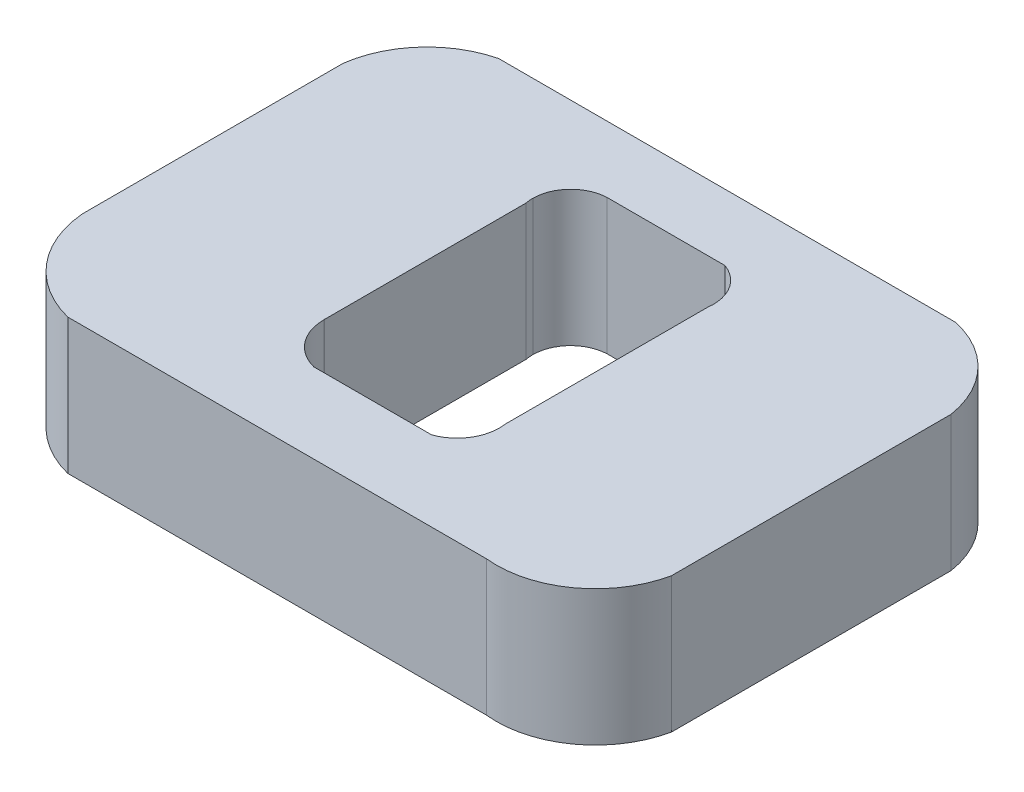
ISO-10303-21;
HEADER;
FILE_DESCRIPTION(('STEP AP214'),'2;1');
FILE_NAME('part.step','',(''),(''),'','','');
FILE_SCHEMA(('AUTOMOTIVE_DESIGN { 1 0 10303 214 1 1 1 1 }'));
ENDSEC;
DATA;
#1=APPLICATION_CONTEXT('core data for automotive mechanical design processes');
#2=APPLICATION_PROTOCOL_DEFINITION('international standard','automotive_design',2000,#1);
#3=PRODUCT_CONTEXT('',#1,'mechanical');
#4=PRODUCT('Part','Part','',(#3));
#5=PRODUCT_RELATED_PRODUCT_CATEGORY('part','',(#4));
#6=PRODUCT_DEFINITION_FORMATION('','',#4);
#7=PRODUCT_DEFINITION_CONTEXT('part definition',#1,'design');
#8=PRODUCT_DEFINITION('design','',#6,#7);
#9=PRODUCT_DEFINITION_SHAPE('','',#8);
#10=(LENGTH_UNIT() NAMED_UNIT(*) SI_UNIT(.MILLI.,.METRE.));
#11=(NAMED_UNIT(*) PLANE_ANGLE_UNIT() SI_UNIT($,.RADIAN.));
#12=(NAMED_UNIT(*) SI_UNIT($,.STERADIAN.) SOLID_ANGLE_UNIT());
#13=UNCERTAINTY_MEASURE_WITH_UNIT(LENGTH_MEASURE(1.E-05),#10,'distance_accuracy_value','');
#14=(GEOMETRIC_REPRESENTATION_CONTEXT(3) GLOBAL_UNCERTAINTY_ASSIGNED_CONTEXT((#13)) GLOBAL_UNIT_ASSIGNED_CONTEXT((#10,
#11,#12)) REPRESENTATION_CONTEXT('',''));
#15=CARTESIAN_POINT('',(0.,0.,0.));
#16=DIRECTION('',(0.,0.,1.));
#17=DIRECTION('',(1.,0.,0.));
#18=AXIS2_PLACEMENT_3D('',#15,#16,#17);
#19=CARTESIAN_POINT('',(79.3009712311584,66.7433443998356,55.2574539082253));
#20=DIRECTION('',(0.,1.,0.));
#21=DIRECTION('',(1.,0.,0.));
#22=AXIS2_PLACEMENT_3D('',#19,#20,#21);
#23=PLANE('',#22);
#24=DIRECTION('',(0.,0.,1.));
#25=VECTOR('',#24,1.);
#26=CARTESIAN_POINT('',(80.1428357703287,66.7433443998356,53.4538721818235));
#27=LINE('',#26,#25);
#28=CARTESIAN_POINT('',(80.1428357703287,66.7433443998356,53.4538721818235));
#29=VERTEX_POINT('',#28);
#30=CARTESIAN_POINT('',(80.1428357703287,66.7433443998356,55.0928511384218));
#31=VERTEX_POINT('',#30);
#32=EDGE_CURVE('E253',#29,#31,#27,.T.);
#33=ORIENTED_EDGE('',*,*,#32,.T.);
#34=CARTESIAN_POINT('',(80.5280816075727,66.7433443998356,55.0950458945253));
#35=DIRECTION('',(0.,1.,0.));
#36=DIRECTION('',(1.,0.,0.));
#37=AXIS2_PLACEMENT_3D('',#34,#35,#36);
#38=CIRCLE('',#37,0.385252088986057);
#39=CARTESIAN_POINT('',(80.1428295185866,66.7433443998356,55.0950458945253));
#40=VERTEX_POINT('',#39);
#41=EDGE_CURVE('E202',#31,#40,#38,.T.);
#42=ORIENTED_EDGE('',*,*,#41,.T.);
#43=CARTESIAN_POINT('',(80.5280816075727,66.7433443998356,55.0950458945253));
#44=DIRECTION('',(0.,1.,0.));
#45=DIRECTION('',(1.,0.,0.));
#46=AXIS2_PLACEMENT_3D('',#43,#44,#45);
#47=CIRCLE('',#46,0.385252088986057);
#48=CARTESIAN_POINT('',(80.4332755038828,66.7433443998356,55.4684504670352));
#49=VERTEX_POINT('',#48);
#50=EDGE_CURVE('E11',#40,#49,#47,.T.);
#51=ORIENTED_EDGE('',*,*,#50,.T.);
#52=DIRECTION('',(1.,0.,0.));
#53=VECTOR('',#52,1.);
#54=CARTESIAN_POINT('',(80.4332755038855,66.7433443998356,55.4684504670377));
#55=LINE('',#54,#53);
#56=CARTESIAN_POINT('',(81.3900175569933,66.7433443998356,55.4684504670377));
#57=VERTEX_POINT('',#56);
#58=EDGE_CURVE('E302',#49,#57,#55,.T.);
#59=ORIENTED_EDGE('',*,*,#58,.T.);
#60=CARTESIAN_POINT('',(81.2742025635334,66.7433443998356,55.1454309023975));
#61=DIRECTION('',(0.,1.,0.));
#62=DIRECTION('',(1.,0.,0.));
#63=AXIS2_PLACEMENT_3D('',#60,#61,#62);
#64=CIRCLE('',#63,0.343154122588132);
#65=CARTESIAN_POINT('',(81.613304495509,66.7433443998356,55.0928511384225));
#66=VERTEX_POINT('',#65);
#67=EDGE_CURVE('E292',#57,#66,#64,.T.);
#68=ORIENTED_EDGE('',*,*,#67,.T.);
#69=DIRECTION('',(0.,0.,-1.));
#70=VECTOR('',#69,1.);
#71=CARTESIAN_POINT('',(81.6133044955103,66.7433443998356,55.0928511384218));
#72=LINE('',#71,#70);
#73=CARTESIAN_POINT('',(81.6133044955103,66.7433443998356,53.4538721818235));
#74=VERTEX_POINT('',#73);
#75=EDGE_CURVE('E282',#66,#74,#72,.T.);
#76=ORIENTED_EDGE('',*,*,#75,.T.);
#77=CARTESIAN_POINT('',(81.2760860279467,66.7433443998356,53.4068481362492));
#78=DIRECTION('',(0.,1.,0.));
#79=DIRECTION('',(1.,0.,0.));
#80=AXIS2_PLACEMENT_3D('',#77,#78,#79);
#81=CIRCLE('',#80,0.340481358854838);
#82=CARTESIAN_POINT('',(81.3900175569946,66.7433443998356,53.085994334002));
#83=VERTEX_POINT('',#82);
#84=EDGE_CURVE('E270',#74,#83,#81,.T.);
#85=ORIENTED_EDGE('',*,*,#84,.T.);
#86=DIRECTION('',(-1.,0.,0.));
#87=VECTOR('',#86,1.);
#88=CARTESIAN_POINT('',(81.3900175569933,66.7433443998356,53.085994334002));
#89=LINE('',#88,#87);
#90=CARTESIAN_POINT('',(80.4332755038855,66.7433443998356,53.085994334002));
#91=VERTEX_POINT('',#90);
#92=EDGE_CURVE('E222',#83,#91,#89,.T.);
#93=ORIENTED_EDGE('',*,*,#92,.T.);
#94=CARTESIAN_POINT('',(80.4450463453946,66.7433443998356,53.3938774958024));
#95=DIRECTION('',(0.,1.,0.));
#96=DIRECTION('',(1.,0.,0.));
#97=AXIS2_PLACEMENT_3D('',#94,#95,#96);
#98=CIRCLE('',#97,0.308108088227954);
#99=CARTESIAN_POINT('',(80.1369382571666,66.7433443998356,53.3938774958024));
#100=VERTEX_POINT('',#99);
#101=EDGE_CURVE('E245',#91,#100,#98,.T.);
#102=ORIENTED_EDGE('',*,*,#101,.T.);
#103=CARTESIAN_POINT('',(80.4450463453946,66.7433443998356,53.3938774958024));
#104=DIRECTION('',(0.,1.,0.));
#105=DIRECTION('',(1.,0.,0.));
#106=AXIS2_PLACEMENT_3D('',#103,#104,#105);
#107=CIRCLE('',#106,0.308108088227954);
#108=EDGE_CURVE('E226',#100,#29,#107,.T.);
#109=ORIENTED_EDGE('',*,*,#108,.T.);
#110=EDGE_LOOP('',(#33,#42,#51,#59,#68,#76,#85,#93,#102,#109));
#111=FACE_BOUND('',#110,.T.);
#112=DIRECTION('',(0.,0.,1.));
#113=VECTOR('',#112,1.);
#114=CARTESIAN_POINT('',(78.4172831325647,66.7433443998356,53.2148543455223));
#115=LINE('',#114,#113);
#116=CARTESIAN_POINT('',(78.4172831325647,66.7433443998356,53.2148543455223));
#117=VERTEX_POINT('',#116);
#118=CARTESIAN_POINT('',(78.4172831325647,66.7433443998356,55.331868974723));
#119=VERTEX_POINT('',#118);
#120=EDGE_CURVE('E312',#117,#119,#115,.T.);
#121=ORIENTED_EDGE('',*,*,#120,.F.);
#122=CARTESIAN_POINT('',(79.2045447036068,66.7433443998356,53.3204440257823));
#123=DIRECTION('',(0.,1.,0.));
#124=DIRECTION('',(1.,0.,0.));
#125=AXIS2_PLACEMENT_3D('',#122,#123,#124);
#126=CIRCLE('',#125,0.794310998171455);
#127=CARTESIAN_POINT('',(79.0152469596229,66.7433443998356,52.5490191584523));
#128=VERTEX_POINT('',#127);
#129=EDGE_CURVE('E46',#128,#117,#126,.T.);
#130=ORIENTED_EDGE('',*,*,#129,.F.);
#131=DIRECTION('',(-1.,0.,0.));
#132=VECTOR('',#131,1.);
#133=CARTESIAN_POINT('',(82.7226225470057,66.7433443998356,52.5490191584523));
#134=LINE('',#133,#132);
#135=CARTESIAN_POINT('',(82.7226225470062,66.7433443998356,52.5490191584516));
#136=VERTEX_POINT('',#135);
#137=EDGE_CURVE('E371',#136,#128,#134,.T.);
#138=ORIENTED_EDGE('',*,*,#137,.F.);
#139=CARTESIAN_POINT('',(82.5575153937022,66.7433443998356,53.3387554200437));
#140=DIRECTION('',(0.,1.,0.));
#141=DIRECTION('',(1.,0.,0.));
#142=AXIS2_PLACEMENT_3D('',#139,#140,#141);
#143=CIRCLE('',#142,0.806810842109651);
#144=CARTESIAN_POINT('',(83.354755795767,66.7433443998356,53.2148543455223));
#145=VERTEX_POINT('',#144);
#146=EDGE_CURVE('E262',#145,#136,#143,.T.);
#147=ORIENTED_EDGE('',*,*,#146,.F.);
#148=DIRECTION('',(0.,0.,-1.));
#149=VECTOR('',#148,1.);
#150=CARTESIAN_POINT('',(83.354755795767,66.7433443998356,55.4855231910342));
#151=LINE('',#150,#149);
#152=CARTESIAN_POINT('',(83.354755795767,66.7433443998356,55.4855231910333));
#153=VERTEX_POINT('',#152);
#154=EDGE_CURVE('E353',#153,#145,#151,.T.);
#155=ORIENTED_EDGE('',*,*,#154,.F.);
#156=CARTESIAN_POINT('',(82.5687237651643,66.7433443998356,55.3180830756956));
#157=DIRECTION('',(0.,1.,0.));
#158=DIRECTION('',(1.,0.,0.));
#159=AXIS2_PLACEMENT_3D('',#156,#157,#158);
#160=CIRCLE('',#159,0.8036681811283);
#161=CARTESIAN_POINT('',(82.4834372969112,66.7433443998356,56.117213079946));
#162=VERTEX_POINT('',#161);
#163=EDGE_CURVE('E341',#162,#153,#160,.T.);
#164=ORIENTED_EDGE('',*,*,#163,.F.);
#165=DIRECTION('',(1.,0.,0.));
#166=VECTOR('',#165,1.);
#167=CARTESIAN_POINT('',(79.0835858030213,66.7433443998356,56.117213079946));
#168=LINE('',#167,#166);
#169=CARTESIAN_POINT('',(79.0835858030213,66.7433443998356,56.1172130799451));
#170=VERTEX_POINT('',#169);
#171=EDGE_CURVE('E219',#170,#162,#168,.T.);
#172=ORIENTED_EDGE('',*,*,#171,.F.);
#173=CARTESIAN_POINT('',(79.3009712311584,66.7433443998356,55.2574539082253));
#174=DIRECTION('',(0.,1.,0.));
#175=DIRECTION('',(1.,0.,0.));
#176=AXIS2_PLACEMENT_3D('',#173,#174,#175);
#177=CIRCLE('',#176,0.886815796951448);
#178=EDGE_CURVE('E229',#119,#170,#177,.T.);
#179=ORIENTED_EDGE('',*,*,#178,.F.);
#180=EDGE_LOOP('',(#121,#130,#138,#147,#155,#164,#172,#179));
#181=FACE_BOUND('',#180,.T.);
#182=ADVANCED_FACE('F16',(#111,#181),#23,.F.);
#183=CARTESIAN_POINT('',(79.3009712311584,67.8433443998356,55.2574539082253));
#184=DIRECTION('',(0.,1.,0.));
#185=DIRECTION('',(1.,0.,0.));
#186=AXIS2_PLACEMENT_3D('',#183,#184,#185);
#187=PLANE('',#186);
#188=DIRECTION('',(0.,0.,1.));
#189=VECTOR('',#188,1.);
#190=CARTESIAN_POINT('',(80.1428357703287,67.8433443998356,53.4538721818235));
#191=LINE('',#190,#189);
#192=CARTESIAN_POINT('',(80.1428357703287,67.8433443998356,53.4538721818235));
#193=VERTEX_POINT('',#192);
#194=CARTESIAN_POINT('',(80.1428357703287,67.8433443998356,55.0928511384218));
#195=VERTEX_POINT('',#194);
#196=EDGE_CURVE('E183',#193,#195,#191,.T.);
#197=ORIENTED_EDGE('',*,*,#196,.F.);
#198=CARTESIAN_POINT('',(80.4450463453946,67.8433443998356,53.3938774958024));
#199=DIRECTION('',(0.,1.,0.));
#200=DIRECTION('',(0.,0.,1.));
#201=AXIS2_PLACEMENT_3D('',#198,#199,#200);
#202=CIRCLE('',#201,0.308108088227961);
#203=CARTESIAN_POINT('',(80.1369382571666,67.8433443998356,53.3938774958024));
#204=VERTEX_POINT('',#203);
#205=EDGE_CURVE('E194',#204,#193,#202,.T.);
#206=ORIENTED_EDGE('',*,*,#205,.F.);
#207=CARTESIAN_POINT('',(80.4450463453946,67.8433443998356,53.3938774958024));
#208=DIRECTION('',(0.,1.,0.));
#209=DIRECTION('',(0.,0.,1.));
#210=AXIS2_PLACEMENT_3D('',#207,#208,#209);
#211=CIRCLE('',#210,0.308108088227961);
#212=CARTESIAN_POINT('',(80.4332755038855,67.8433443998356,53.085994334002));
#213=VERTEX_POINT('',#212);
#214=EDGE_CURVE('E204',#213,#204,#211,.T.);
#215=ORIENTED_EDGE('',*,*,#214,.F.);
#216=DIRECTION('',(-1.,0.,0.));
#217=VECTOR('',#216,1.);
#218=CARTESIAN_POINT('',(81.3900175569933,67.8433443998356,53.085994334002));
#219=LINE('',#218,#217);
#220=CARTESIAN_POINT('',(81.3900175569946,67.8433443998356,53.085994334002));
#221=VERTEX_POINT('',#220);
#222=EDGE_CURVE('E236',#221,#213,#219,.T.);
#223=ORIENTED_EDGE('',*,*,#222,.F.);
#224=CARTESIAN_POINT('',(81.2760860279467,67.8433443998356,53.4068481362492));
#225=DIRECTION('',(0.,1.,0.));
#226=DIRECTION('',(0.,0.,1.));
#227=AXIS2_PLACEMENT_3D('',#224,#225,#226);
#228=CIRCLE('',#227,0.340481358854845);
#229=CARTESIAN_POINT('',(81.6133044955103,67.8433443998356,53.4538721818235));
#230=VERTEX_POINT('',#229);
#231=EDGE_CURVE('E279',#230,#221,#228,.T.);
#232=ORIENTED_EDGE('',*,*,#231,.F.);
#233=DIRECTION('',(0.,0.,-1.));
#234=VECTOR('',#233,1.);
#235=CARTESIAN_POINT('',(81.6133044955103,67.8433443998356,55.0928511384218));
#236=LINE('',#235,#234);
#237=CARTESIAN_POINT('',(81.613304495509,67.8433443998356,55.0928511384225));
#238=VERTEX_POINT('',#237);
#239=EDGE_CURVE('E289',#238,#230,#236,.T.);
#240=ORIENTED_EDGE('',*,*,#239,.F.);
#241=CARTESIAN_POINT('',(81.2742025635334,67.8433443998356,55.1454309023975));
#242=DIRECTION('',(0.,1.,0.));
#243=DIRECTION('',(0.,0.,1.));
#244=AXIS2_PLACEMENT_3D('',#241,#242,#243);
#245=CIRCLE('',#244,0.343154122588125);
#246=CARTESIAN_POINT('',(81.3900175569933,67.8433443998356,55.4684504670377));
#247=VERTEX_POINT('',#246);
#248=EDGE_CURVE('E299',#247,#238,#245,.T.);
#249=ORIENTED_EDGE('',*,*,#248,.F.);
#250=DIRECTION('',(1.,0.,0.));
#251=VECTOR('',#250,1.);
#252=CARTESIAN_POINT('',(80.4332755038855,67.8433443998356,55.4684504670377));
#253=LINE('',#252,#251);
#254=CARTESIAN_POINT('',(80.4332755038828,67.8433443998356,55.4684504670352));
#255=VERTEX_POINT('',#254);
#256=EDGE_CURVE('E309',#255,#247,#253,.T.);
#257=ORIENTED_EDGE('',*,*,#256,.F.);
#258=CARTESIAN_POINT('',(80.5280816075727,67.8433443998356,55.0950458945253));
#259=DIRECTION('',(0.,1.,0.));
#260=DIRECTION('',(0.,0.,1.));
#261=AXIS2_PLACEMENT_3D('',#258,#259,#260);
#262=CIRCLE('',#261,0.385252088986064);
#263=CARTESIAN_POINT('',(80.1428295185866,67.8433443998356,55.0950458945253));
#264=VERTEX_POINT('',#263);
#265=EDGE_CURVE('E25',#264,#255,#262,.T.);
#266=ORIENTED_EDGE('',*,*,#265,.F.);
#267=CARTESIAN_POINT('',(80.5280816075727,67.8433443998356,55.0950458945253));
#268=DIRECTION('',(0.,1.,0.));
#269=DIRECTION('',(0.,0.,1.));
#270=AXIS2_PLACEMENT_3D('',#267,#268,#269);
#271=CIRCLE('',#270,0.385252088986064);
#272=EDGE_CURVE('E200',#195,#264,#271,.T.);
#273=ORIENTED_EDGE('',*,*,#272,.F.);
#274=EDGE_LOOP('',(#197,#206,#215,#223,#232,#240,#249,#257,#266,#273));
#275=FACE_BOUND('',#274,.T.);
#276=DIRECTION('',(0.,0.,1.));
#277=VECTOR('',#276,1.);
#278=CARTESIAN_POINT('',(78.4172831325647,67.8433443998356,53.2148543455223));
#279=LINE('',#278,#277);
#280=CARTESIAN_POINT('',(78.4172831325647,67.8433443998356,53.2148543455223));
#281=VERTEX_POINT('',#280);
#282=CARTESIAN_POINT('',(78.4172831325647,67.8433443998356,55.331868974723));
#283=VERTEX_POINT('',#282);
#284=EDGE_CURVE('E320',#281,#283,#279,.T.);
#285=ORIENTED_EDGE('',*,*,#284,.T.);
#286=CARTESIAN_POINT('',(79.3009712311584,67.8433443998356,55.2574539082253));
#287=DIRECTION('',(0.,1.,0.));
#288=DIRECTION('',(0.,0.,1.));
#289=AXIS2_PLACEMENT_3D('',#286,#287,#288);
#290=CIRCLE('',#289,0.886815796951456);
#291=CARTESIAN_POINT('',(79.0835858030213,67.8433443998356,56.1172130799451));
#292=VERTEX_POINT('',#291);
#293=EDGE_CURVE('E217',#283,#292,#290,.T.);
#294=ORIENTED_EDGE('',*,*,#293,.T.);
#295=DIRECTION('',(1.,0.,0.));
#296=VECTOR('',#295,1.);
#297=CARTESIAN_POINT('',(79.0835858030213,67.8433443998356,56.117213079946));
#298=LINE('',#297,#296);
#299=CARTESIAN_POINT('',(82.4834372969112,67.8433443998356,56.117213079946));
#300=VERTEX_POINT('',#299);
#301=EDGE_CURVE('E337',#292,#300,#298,.T.);
#302=ORIENTED_EDGE('',*,*,#301,.T.);
#303=CARTESIAN_POINT('',(82.5687237651643,67.8433443998356,55.3180830756956));
#304=DIRECTION('',(0.,1.,0.));
#305=DIRECTION('',(0.,0.,1.));
#306=AXIS2_PLACEMENT_3D('',#303,#304,#305);
#307=CIRCLE('',#306,0.803668181128293);
#308=CARTESIAN_POINT('',(83.354755795767,67.8433443998356,55.4855231910333));
#309=VERTEX_POINT('',#308);
#310=EDGE_CURVE('E349',#300,#309,#307,.T.);
#311=ORIENTED_EDGE('',*,*,#310,.T.);
#312=DIRECTION('',(0.,0.,-1.));
#313=VECTOR('',#312,1.);
#314=CARTESIAN_POINT('',(83.354755795767,67.8433443998356,55.4855231910342));
#315=LINE('',#314,#313);
#316=CARTESIAN_POINT('',(83.354755795767,67.8433443998356,53.2148543455223));
#317=VERTEX_POINT('',#316);
#318=EDGE_CURVE('E267',#309,#317,#315,.T.);
#319=ORIENTED_EDGE('',*,*,#318,.T.);
#320=CARTESIAN_POINT('',(82.5575153937022,67.8433443998356,53.3387554200437));
#321=DIRECTION('',(0.,1.,0.));
#322=DIRECTION('',(0.,0.,1.));
#323=AXIS2_PLACEMENT_3D('',#320,#321,#322);
#324=CIRCLE('',#323,0.806810842109644);
#325=CARTESIAN_POINT('',(82.7226225470062,67.8433443998356,52.5490191584516));
#326=VERTEX_POINT('',#325);
#327=EDGE_CURVE('E367',#317,#326,#324,.T.);
#328=ORIENTED_EDGE('',*,*,#327,.T.);
#329=DIRECTION('',(-1.,0.,0.));
#330=VECTOR('',#329,1.);
#331=CARTESIAN_POINT('',(82.7226225470057,67.8433443998356,52.5490191584523));
#332=LINE('',#331,#330);
#333=CARTESIAN_POINT('',(79.0152469596229,67.8433443998356,52.5490191584523));
#334=VERTEX_POINT('',#333);
#335=EDGE_CURVE('E378',#326,#334,#332,.T.);
#336=ORIENTED_EDGE('',*,*,#335,.T.);
#337=CARTESIAN_POINT('',(79.2045447036068,67.8433443998356,53.3204440257823));
#338=DIRECTION('',(0.,1.,0.));
#339=DIRECTION('',(0.,0.,1.));
#340=AXIS2_PLACEMENT_3D('',#337,#338,#339);
#341=CIRCLE('',#340,0.794310998171455);
#342=EDGE_CURVE('E36',#334,#281,#341,.T.);
#343=ORIENTED_EDGE('',*,*,#342,.T.);
#344=EDGE_LOOP('',(#285,#294,#302,#311,#319,#328,#336,#343));
#345=FACE_BOUND('',#344,.T.);
#346=ADVANCED_FACE('F18',(#275,#345),#187,.T.);
#347=CARTESIAN_POINT('',(80.5280816075727,67.7433443998356,55.0950458945253));
#348=DIRECTION('',(0.,-1.,0.));
#349=DIRECTION('',(-1.,0.,0.));
#350=AXIS2_PLACEMENT_3D('',#347,#348,#349);
#351=CYLINDRICAL_SURFACE('',#350,0.385252088986057);
#352=DIRECTION('',(0.,-1.,0.));
#353=VECTOR('',#352,1.);
#354=CARTESIAN_POINT('',(80.1428295185866,67.7433443998356,55.0950458945253));
#355=LINE('',#354,#353);
#356=EDGE_CURVE('E210',#264,#40,#355,.T.);
#357=ORIENTED_EDGE('',*,*,#356,.F.);
#358=ORIENTED_EDGE('',*,*,#265,.T.);
#359=DIRECTION('',(0.,-1.,0.));
#360=VECTOR('',#359,1.);
#361=CARTESIAN_POINT('',(80.4332755038828,67.7433443998356,55.4684504670352));
#362=LINE('',#361,#360);
#363=EDGE_CURVE('E305',#255,#49,#362,.T.);
#364=ORIENTED_EDGE('',*,*,#363,.T.);
#365=ORIENTED_EDGE('',*,*,#50,.F.);
#366=EDGE_LOOP('',(#357,#358,#364,#365));
#367=FACE_BOUND('',#366,.T.);
#368=ADVANCED_FACE('F385',(#367),#351,.F.);
#369=CARTESIAN_POINT('',(79.2045447036068,67.7433443998356,53.3204440257823));
#370=DIRECTION('',(0.,-1.,0.));
#371=DIRECTION('',(-1.,0.,0.));
#372=AXIS2_PLACEMENT_3D('',#369,#370,#371);
#373=CYLINDRICAL_SURFACE('',#372,0.794310998171455);
#374=ORIENTED_EDGE('',*,*,#129,.T.);
#375=DIRECTION('',(0.,-1.,0.));
#376=VECTOR('',#375,1.);
#377=CARTESIAN_POINT('',(78.4172831325647,67.7433443998356,53.2148543455223));
#378=LINE('',#377,#376);
#379=EDGE_CURVE('E233',#281,#117,#378,.T.);
#380=ORIENTED_EDGE('',*,*,#379,.F.);
#381=ORIENTED_EDGE('',*,*,#342,.F.);
#382=DIRECTION('',(0.,-1.,0.));
#383=VECTOR('',#382,1.);
#384=CARTESIAN_POINT('',(79.0152469596229,67.7433443998356,52.5490191584523));
#385=LINE('',#384,#383);
#386=EDGE_CURVE('E375',#334,#128,#385,.T.);
#387=ORIENTED_EDGE('',*,*,#386,.T.);
#388=EDGE_LOOP('',(#374,#380,#381,#387));
#389=FACE_BOUND('',#388,.T.);
#390=ADVANCED_FACE('F452',(#389),#373,.T.);
#391=CARTESIAN_POINT('',(82.7226225470057,67.7433443998356,52.5490191584523));
#392=DIRECTION('',(0.,0.,1.));
#393=DIRECTION('',(1.,0.,0.));
#394=AXIS2_PLACEMENT_3D('',#391,#392,#393);
#395=PLANE('',#394);
#396=ORIENTED_EDGE('',*,*,#137,.T.);
#397=ORIENTED_EDGE('',*,*,#386,.F.);
#398=ORIENTED_EDGE('',*,*,#335,.F.);
#399=DIRECTION('',(0.,-1.,0.));
#400=VECTOR('',#399,1.);
#401=CARTESIAN_POINT('',(82.7226225470062,67.7433443998356,52.5490191584516));
#402=LINE('',#401,#400);
#403=EDGE_CURVE('E266',#326,#136,#402,.T.);
#404=ORIENTED_EDGE('',*,*,#403,.T.);
#405=EDGE_LOOP('',(#396,#397,#398,#404));
#406=FACE_BOUND('',#405,.T.);
#407=ADVANCED_FACE('F437',(#406),#395,.F.);
#408=CARTESIAN_POINT('',(82.5575153937022,67.7433443998356,53.3387554200437));
#409=DIRECTION('',(0.,-1.,0.));
#410=DIRECTION('',(-1.,0.,0.));
#411=AXIS2_PLACEMENT_3D('',#408,#409,#410);
#412=CYLINDRICAL_SURFACE('',#411,0.806810842109651);
#413=ORIENTED_EDGE('',*,*,#146,.T.);
#414=ORIENTED_EDGE('',*,*,#403,.F.);
#415=ORIENTED_EDGE('',*,*,#327,.F.);
#416=DIRECTION('',(0.,-1.,0.));
#417=VECTOR('',#416,1.);
#418=CARTESIAN_POINT('',(83.354755795767,67.7433443998356,53.2148543455223));
#419=LINE('',#418,#417);
#420=EDGE_CURVE('E357',#317,#145,#419,.T.);
#421=ORIENTED_EDGE('',*,*,#420,.T.);
#422=EDGE_LOOP('',(#413,#414,#415,#421));
#423=FACE_BOUND('',#422,.T.);
#424=ADVANCED_FACE('F441',(#423),#412,.T.);
#425=CARTESIAN_POINT('',(83.354755795767,67.7433443998356,55.4855231910342));
#426=DIRECTION('',(-1.,0.,0.));
#427=DIRECTION('',(0.,0.,1.));
#428=AXIS2_PLACEMENT_3D('',#425,#426,#427);
#429=PLANE('',#428);
#430=ORIENTED_EDGE('',*,*,#154,.T.);
#431=ORIENTED_EDGE('',*,*,#420,.F.);
#432=ORIENTED_EDGE('',*,*,#318,.F.);
#433=DIRECTION('',(0.,-1.,0.));
#434=VECTOR('',#433,1.);
#435=CARTESIAN_POINT('',(83.354755795767,67.7433443998356,55.4855231910333));
#436=LINE('',#435,#434);
#437=EDGE_CURVE('E345',#309,#153,#436,.T.);
#438=ORIENTED_EDGE('',*,*,#437,.T.);
#439=EDGE_LOOP('',(#430,#431,#432,#438));
#440=FACE_BOUND('',#439,.T.);
#441=ADVANCED_FACE('F443',(#440),#429,.F.);
#442=CARTESIAN_POINT('',(82.5687237651643,67.7433443998356,55.3180830756956));
#443=DIRECTION('',(0.,-1.,0.));
#444=DIRECTION('',(-1.,0.,0.));
#445=AXIS2_PLACEMENT_3D('',#442,#443,#444);
#446=CYLINDRICAL_SURFACE('',#445,0.8036681811283);
#447=ORIENTED_EDGE('',*,*,#163,.T.);
#448=ORIENTED_EDGE('',*,*,#437,.F.);
#449=ORIENTED_EDGE('',*,*,#310,.F.);
#450=DIRECTION('',(0.,-1.,0.));
#451=VECTOR('',#450,1.);
#452=CARTESIAN_POINT('',(82.4834372969112,67.7433443998356,56.117213079946));
#453=LINE('',#452,#451);
#454=EDGE_CURVE('E333',#300,#162,#453,.T.);
#455=ORIENTED_EDGE('',*,*,#454,.T.);
#456=EDGE_LOOP('',(#447,#448,#449,#455));
#457=FACE_BOUND('',#456,.T.);
#458=ADVANCED_FACE('F449',(#457),#446,.T.);
#459=CARTESIAN_POINT('',(79.0835858030213,67.7433443998356,56.117213079946));
#460=DIRECTION('',(0.,0.,-1.));
#461=DIRECTION('',(0.,-1.,0.));
#462=AXIS2_PLACEMENT_3D('',#459,#460,#461);
#463=PLANE('',#462);
#464=ORIENTED_EDGE('',*,*,#171,.T.);
#465=ORIENTED_EDGE('',*,*,#454,.F.);
#466=ORIENTED_EDGE('',*,*,#301,.F.);
#467=DIRECTION('',(0.,-1.,0.));
#468=VECTOR('',#467,1.);
#469=CARTESIAN_POINT('',(79.0835858030213,67.7433443998356,56.1172130799451));
#470=LINE('',#469,#468);
#471=EDGE_CURVE('E220',#292,#170,#470,.T.);
#472=ORIENTED_EDGE('',*,*,#471,.T.);
#473=EDGE_LOOP('',(#464,#465,#466,#472));
#474=FACE_BOUND('',#473,.T.);
#475=ADVANCED_FACE('F462',(#474),#463,.F.);
#476=CARTESIAN_POINT('',(79.3009712311584,67.7433443998356,55.2574539082253));
#477=DIRECTION('',(0.,-1.,0.));
#478=DIRECTION('',(-1.,0.,0.));
#479=AXIS2_PLACEMENT_3D('',#476,#477,#478);
#480=CYLINDRICAL_SURFACE('',#479,0.886815796951448);
#481=ORIENTED_EDGE('',*,*,#178,.T.);
#482=ORIENTED_EDGE('',*,*,#471,.F.);
#483=ORIENTED_EDGE('',*,*,#293,.F.);
#484=DIRECTION('',(0.,-1.,0.));
#485=VECTOR('',#484,1.);
#486=CARTESIAN_POINT('',(78.4172831325647,67.7433443998356,55.331868974723));
#487=LINE('',#486,#485);
#488=EDGE_CURVE('E316',#283,#119,#487,.T.);
#489=ORIENTED_EDGE('',*,*,#488,.T.);
#490=EDGE_LOOP('',(#481,#482,#483,#489));
#491=FACE_BOUND('',#490,.T.);
#492=ADVANCED_FACE('F464',(#491),#480,.T.);
#493=CARTESIAN_POINT('',(78.4172831325647,67.7433443998356,53.2148543455223));
#494=DIRECTION('',(1.,0.,0.));
#495=DIRECTION('',(0.,1.,0.));
#496=AXIS2_PLACEMENT_3D('',#493,#494,#495);
#497=PLANE('',#496);
#498=ORIENTED_EDGE('',*,*,#120,.T.);
#499=ORIENTED_EDGE('',*,*,#488,.F.);
#500=ORIENTED_EDGE('',*,*,#284,.F.);
#501=ORIENTED_EDGE('',*,*,#379,.T.);
#502=EDGE_LOOP('',(#498,#499,#500,#501));
#503=FACE_BOUND('',#502,.T.);
#504=ADVANCED_FACE('F427',(#503),#497,.F.);
#505=CARTESIAN_POINT('',(80.4332755038855,67.7433443998356,55.4684504670377));
#506=DIRECTION('',(0.,0.,-1.));
#507=DIRECTION('',(0.,-1.,0.));
#508=AXIS2_PLACEMENT_3D('',#505,#506,#507);
#509=PLANE('',#508);
#510=ORIENTED_EDGE('',*,*,#58,.F.);
#511=ORIENTED_EDGE('',*,*,#363,.F.);
#512=ORIENTED_EDGE('',*,*,#256,.T.);
#513=DIRECTION('',(0.,-1.,0.));
#514=VECTOR('',#513,1.);
#515=CARTESIAN_POINT('',(81.3900175569933,67.7433443998356,55.4684504670377));
#516=LINE('',#515,#514);
#517=EDGE_CURVE('E295',#247,#57,#516,.T.);
#518=ORIENTED_EDGE('',*,*,#517,.T.);
#519=EDGE_LOOP('',(#510,#511,#512,#518));
#520=FACE_BOUND('',#519,.T.);
#521=ADVANCED_FACE('F392',(#520),#509,.T.);
#522=CARTESIAN_POINT('',(81.2742025635334,67.7433443998356,55.1454309023975));
#523=DIRECTION('',(0.,-1.,0.));
#524=DIRECTION('',(-1.,0.,0.));
#525=AXIS2_PLACEMENT_3D('',#522,#523,#524);
#526=CYLINDRICAL_SURFACE('',#525,0.343154122588132);
#527=ORIENTED_EDGE('',*,*,#67,.F.);
#528=ORIENTED_EDGE('',*,*,#517,.F.);
#529=ORIENTED_EDGE('',*,*,#248,.T.);
#530=DIRECTION('',(0.,-1.,0.));
#531=VECTOR('',#530,1.);
#532=CARTESIAN_POINT('',(81.613304495509,67.7433443998356,55.0928511384225));
#533=LINE('',#532,#531);
#534=EDGE_CURVE('E285',#238,#66,#533,.T.);
#535=ORIENTED_EDGE('',*,*,#534,.T.);
#536=EDGE_LOOP('',(#527,#528,#529,#535));
#537=FACE_BOUND('',#536,.T.);
#538=ADVANCED_FACE('F418',(#537),#526,.F.);
#539=CARTESIAN_POINT('',(81.6133044955103,67.7433443998356,55.0928511384218));
#540=DIRECTION('',(-1.,0.,0.));
#541=DIRECTION('',(0.,0.,1.));
#542=AXIS2_PLACEMENT_3D('',#539,#540,#541);
#543=PLANE('',#542);
#544=ORIENTED_EDGE('',*,*,#75,.F.);
#545=ORIENTED_EDGE('',*,*,#534,.F.);
#546=ORIENTED_EDGE('',*,*,#239,.T.);
#547=DIRECTION('',(0.,-1.,0.));
#548=VECTOR('',#547,1.);
#549=CARTESIAN_POINT('',(81.6133044955103,67.7433443998356,53.4538721818235));
#550=LINE('',#549,#548);
#551=EDGE_CURVE('E275',#230,#74,#550,.T.);
#552=ORIENTED_EDGE('',*,*,#551,.T.);
#553=EDGE_LOOP('',(#544,#545,#546,#552));
#554=FACE_BOUND('',#553,.T.);
#555=ADVANCED_FACE('F416',(#554),#543,.T.);
#556=CARTESIAN_POINT('',(81.2760860279467,67.7433443998356,53.4068481362492));
#557=DIRECTION('',(0.,-1.,0.));
#558=DIRECTION('',(-1.,0.,0.));
#559=AXIS2_PLACEMENT_3D('',#556,#557,#558);
#560=CYLINDRICAL_SURFACE('',#559,0.340481358854838);
#561=ORIENTED_EDGE('',*,*,#84,.F.);
#562=ORIENTED_EDGE('',*,*,#551,.F.);
#563=ORIENTED_EDGE('',*,*,#231,.T.);
#564=DIRECTION('',(0.,-1.,0.));
#565=VECTOR('',#564,1.);
#566=CARTESIAN_POINT('',(81.3900175569946,67.7433443998356,53.085994334002));
#567=LINE('',#566,#565);
#568=EDGE_CURVE('E225',#221,#83,#567,.T.);
#569=ORIENTED_EDGE('',*,*,#568,.T.);
#570=EDGE_LOOP('',(#561,#562,#563,#569));
#571=FACE_BOUND('',#570,.T.);
#572=ADVANCED_FACE('F411',(#571),#560,.F.);
#573=CARTESIAN_POINT('',(81.3900175569933,67.7433443998356,53.085994334002));
#574=DIRECTION('',(0.,0.,1.));
#575=DIRECTION('',(1.,0.,0.));
#576=AXIS2_PLACEMENT_3D('',#573,#574,#575);
#577=PLANE('',#576);
#578=ORIENTED_EDGE('',*,*,#92,.F.);
#579=ORIENTED_EDGE('',*,*,#568,.F.);
#580=ORIENTED_EDGE('',*,*,#222,.T.);
#581=DIRECTION('',(0.,-1.,0.));
#582=VECTOR('',#581,1.);
#583=CARTESIAN_POINT('',(80.4332755038855,67.7433443998356,53.085994334002));
#584=LINE('',#583,#582);
#585=EDGE_CURVE('E249',#213,#91,#584,.T.);
#586=ORIENTED_EDGE('',*,*,#585,.T.);
#587=EDGE_LOOP('',(#578,#579,#580,#586));
#588=FACE_BOUND('',#587,.T.);
#589=ADVANCED_FACE('F408',(#588),#577,.T.);
#590=CARTESIAN_POINT('',(80.4450463453946,67.7433443998356,53.3938774958024));
#591=DIRECTION('',(0.,-1.,0.));
#592=DIRECTION('',(-1.,0.,0.));
#593=AXIS2_PLACEMENT_3D('',#590,#591,#592);
#594=CYLINDRICAL_SURFACE('',#593,0.308108088227954);
#595=DIRECTION('',(0.,-1.,0.));
#596=VECTOR('',#595,1.);
#597=CARTESIAN_POINT('',(80.1369382571666,67.7433443998356,53.3938774958024));
#598=LINE('',#597,#596);
#599=EDGE_CURVE('E241',#204,#100,#598,.T.);
#600=ORIENTED_EDGE('',*,*,#599,.F.);
#601=ORIENTED_EDGE('',*,*,#205,.T.);
#602=DIRECTION('',(0.,-1.,0.));
#603=VECTOR('',#602,1.);
#604=CARTESIAN_POINT('',(80.1428357703287,67.7433443998356,53.4538721818235));
#605=LINE('',#604,#603);
#606=EDGE_CURVE('E190',#193,#29,#605,.T.);
#607=ORIENTED_EDGE('',*,*,#606,.T.);
#608=ORIENTED_EDGE('',*,*,#108,.F.);
#609=EDGE_LOOP('',(#600,#601,#607,#608));
#610=FACE_BOUND('',#609,.T.);
#611=ADVANCED_FACE('F398',(#610),#594,.F.);
#612=CARTESIAN_POINT('',(80.1428357703287,67.7433443998356,53.4538721818235));
#613=DIRECTION('',(1.,0.,0.));
#614=DIRECTION('',(0.,1.,0.));
#615=AXIS2_PLACEMENT_3D('',#612,#613,#614);
#616=PLANE('',#615);
#617=ORIENTED_EDGE('',*,*,#32,.F.);
#618=ORIENTED_EDGE('',*,*,#606,.F.);
#619=ORIENTED_EDGE('',*,*,#196,.T.);
#620=DIRECTION('',(0.,-1.,0.));
#621=VECTOR('',#620,1.);
#622=CARTESIAN_POINT('',(80.1428357703287,67.7433443998356,55.0928511384218));
#623=LINE('',#622,#621);
#624=EDGE_CURVE('E187',#195,#31,#623,.T.);
#625=ORIENTED_EDGE('',*,*,#624,.T.);
#626=EDGE_LOOP('',(#617,#618,#619,#625));
#627=FACE_BOUND('',#626,.T.);
#628=ADVANCED_FACE('F186',(#627),#616,.T.);
#629=CARTESIAN_POINT('',(80.4450463453946,67.7433443998356,53.3938774958024));
#630=DIRECTION('',(0.,-1.,0.));
#631=DIRECTION('',(-1.,0.,0.));
#632=AXIS2_PLACEMENT_3D('',#629,#630,#631);
#633=CYLINDRICAL_SURFACE('',#632,0.308108088227954);
#634=ORIENTED_EDGE('',*,*,#214,.T.);
#635=ORIENTED_EDGE('',*,*,#599,.T.);
#636=ORIENTED_EDGE('',*,*,#101,.F.);
#637=ORIENTED_EDGE('',*,*,#585,.F.);
#638=EDGE_LOOP('',(#634,#635,#636,#637));
#639=FACE_BOUND('',#638,.T.);
#640=ADVANCED_FACE('F405',(#639),#633,.F.);
#641=CARTESIAN_POINT('',(80.5280816075727,67.7433443998356,55.0950458945253));
#642=DIRECTION('',(0.,-1.,0.));
#643=DIRECTION('',(-1.,0.,0.));
#644=AXIS2_PLACEMENT_3D('',#641,#642,#643);
#645=CYLINDRICAL_SURFACE('',#644,0.385252088986057);
#646=ORIENTED_EDGE('',*,*,#272,.T.);
#647=ORIENTED_EDGE('',*,*,#356,.T.);
#648=ORIENTED_EDGE('',*,*,#41,.F.);
#649=ORIENTED_EDGE('',*,*,#624,.F.);
#650=EDGE_LOOP('',(#646,#647,#648,#649));
#651=FACE_BOUND('',#650,.T.);
#652=ADVANCED_FACE('F198',(#651),#645,.F.);
#653=CLOSED_SHELL('',(#182,#346,#368,#390,#407,#424,#441,#458,#475,#492,#504,#521,#538,#555,
#572,#589,#611,#628,#640,#652));
#654=MANIFOLD_SOLID_BREP('B1',#653);
#655=ADVANCED_BREP_SHAPE_REPRESENTATION('',(#18,#654),#14);
#656=SHAPE_DEFINITION_REPRESENTATION(#9,#655);
ENDSEC;
END-ISO-10303-21;
